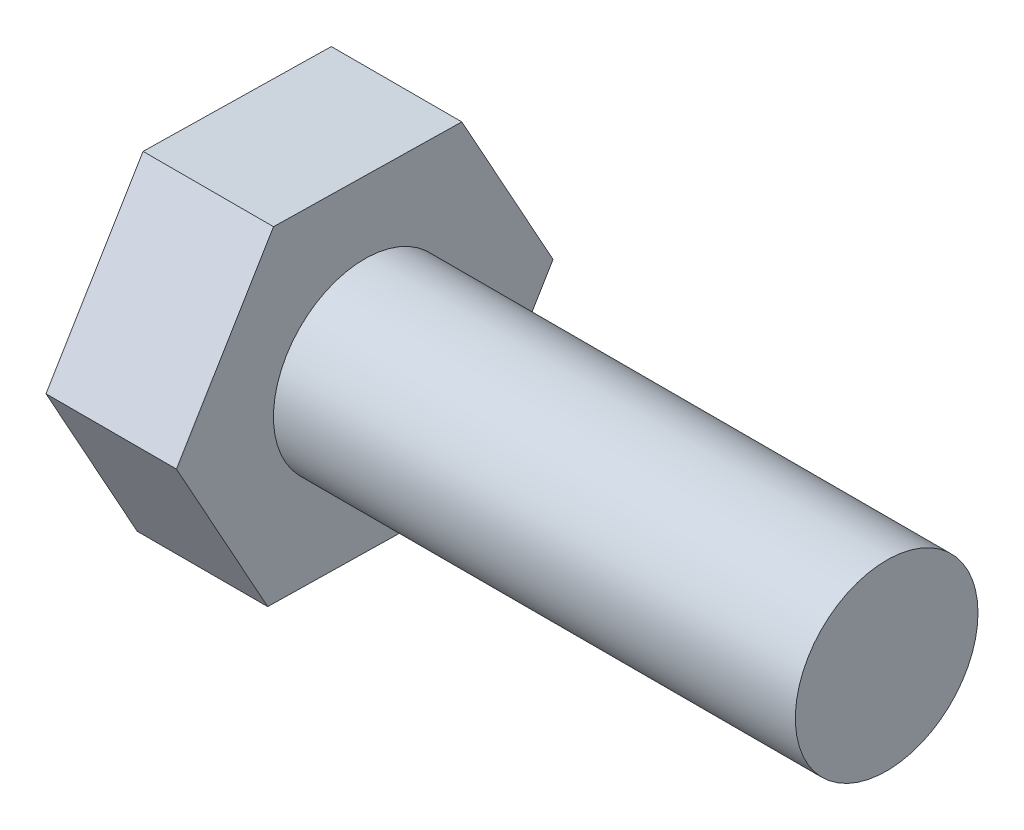
ISO-10303-21;
HEADER;
FILE_DESCRIPTION(('STEP AP214'),'2;1');
FILE_NAME('part.step','',(''),(''),'','','');
FILE_SCHEMA(('AUTOMOTIVE_DESIGN { 1 0 10303 214 1 1 1 1 }'));
ENDSEC;
DATA;
#1=APPLICATION_CONTEXT('core data for automotive mechanical design processes');
#2=APPLICATION_PROTOCOL_DEFINITION('international standard','automotive_design',2000,#1);
#3=PRODUCT_CONTEXT('',#1,'mechanical');
#4=PRODUCT('Part','Part','',(#3));
#5=PRODUCT_RELATED_PRODUCT_CATEGORY('part','',(#4));
#6=PRODUCT_DEFINITION_FORMATION('','',#4);
#7=PRODUCT_DEFINITION_CONTEXT('part definition',#1,'design');
#8=PRODUCT_DEFINITION('design','',#6,#7);
#9=PRODUCT_DEFINITION_SHAPE('','',#8);
#10=(LENGTH_UNIT() NAMED_UNIT(*) SI_UNIT(.MILLI.,.METRE.));
#11=(NAMED_UNIT(*) PLANE_ANGLE_UNIT() SI_UNIT($,.RADIAN.));
#12=(NAMED_UNIT(*) SI_UNIT($,.STERADIAN.) SOLID_ANGLE_UNIT());
#13=UNCERTAINTY_MEASURE_WITH_UNIT(LENGTH_MEASURE(1.E-05),#10,'distance_accuracy_value','');
#14=(GEOMETRIC_REPRESENTATION_CONTEXT(3) GLOBAL_UNCERTAINTY_ASSIGNED_CONTEXT((#13)) GLOBAL_UNIT_ASSIGNED_CONTEXT((#10,
#11,#12)) REPRESENTATION_CONTEXT('',''));
#15=CARTESIAN_POINT('',(0.,0.,0.));
#16=DIRECTION('',(0.,0.,1.));
#17=DIRECTION('',(1.,0.,0.));
#18=AXIS2_PLACEMENT_3D('',#15,#16,#17);
#19=CARTESIAN_POINT('',(-10.6,0.256906077015476,14.4314702161951));
#20=DIRECTION('',(0.,-0.515335157468267,-0.856988725408425));
#21=DIRECTION('',(0.,0.856988725408425,-0.515335157468267));
#22=AXIS2_PLACEMENT_3D('',#19,#20,#21);
#23=PLANE('',#22);
#24=DIRECTION('',(0.,0.856988725408425,-0.515335157468267));
#25=VECTOR('',#24,1.);
#26=CARTESIAN_POINT('',(-0.6,0.256906077015476,14.4314702161951));
#27=LINE('',#26,#25);
#28=CARTESIAN_POINT('',(-0.6,0.256906077015476,14.4314702161951));
#29=VERTEX_POINT('',#28);
#30=CARTESIAN_POINT('',(-0.6,12.6264728596912,6.99324791901554));
#31=VERTEX_POINT('',#30);
#32=EDGE_CURVE('E126',#29,#31,#27,.T.);
#33=ORIENTED_EDGE('',*,*,#32,.T.);
#34=DIRECTION('',(1.,0.,0.));
#35=VECTOR('',#34,1.);
#36=CARTESIAN_POINT('',(-10.6,12.6264728596912,6.99324791901554));
#37=LINE('',#36,#35);
#38=CARTESIAN_POINT('',(-10.6,12.6264728596912,6.99324791901554));
#39=VERTEX_POINT('',#38);
#40=EDGE_CURVE('E143',#39,#31,#37,.T.);
#41=ORIENTED_EDGE('',*,*,#40,.F.);
#42=DIRECTION('',(0.,0.856988725408425,-0.515335157468267));
#43=VECTOR('',#42,1.);
#44=CARTESIAN_POINT('',(-10.6,0.256906077015476,14.4314702161951));
#45=LINE('',#44,#43);
#46=CARTESIAN_POINT('',(-10.6,0.256906077015476,14.4314702161951));
#47=VERTEX_POINT('',#46);
#48=EDGE_CURVE('E136',#47,#39,#45,.T.);
#49=ORIENTED_EDGE('',*,*,#48,.F.);
#50=DIRECTION('',(1.,0.,0.));
#51=VECTOR('',#50,1.);
#52=CARTESIAN_POINT('',(-10.6,0.256906077015476,14.4314702161951));
#53=LINE('',#52,#51);
#54=EDGE_CURVE('E122',#47,#29,#53,.T.);
#55=ORIENTED_EDGE('',*,*,#54,.T.);
#56=EDGE_LOOP('',(#33,#41,#49,#55));
#57=FACE_BOUND('',#56,.T.);
#58=ADVANCED_FACE('F40',(#57),#23,.F.);
#59=CARTESIAN_POINT('',(-10.6,12.6264728596912,6.99324791901554));
#60=DIRECTION('',(0.,-0.999841585694676,0.01779897512656));
#61=DIRECTION('',(0.,-0.01779897512656,-0.999841585694676));
#62=AXIS2_PLACEMENT_3D('',#59,#60,#61);
#63=PLANE('',#62);
#64=DIRECTION('',(0.,-0.01779897512656,-0.999841585694676));
#65=VECTOR('',#64,1.);
#66=CARTESIAN_POINT('',(-0.6,12.6264728596912,6.99324791901554));
#67=LINE('',#66,#65);
#68=CARTESIAN_POINT('',(-0.6,12.3695667826757,-7.43822229717955));
#69=VERTEX_POINT('',#68);
#70=EDGE_CURVE('E129',#31,#69,#67,.T.);
#71=ORIENTED_EDGE('',*,*,#70,.T.);
#72=DIRECTION('',(1.,0.,0.));
#73=VECTOR('',#72,1.);
#74=CARTESIAN_POINT('',(-10.6,12.3695667826757,-7.43822229717955));
#75=LINE('',#74,#73);
#76=CARTESIAN_POINT('',(-10.6,12.3695667826757,-7.43822229717955));
#77=VERTEX_POINT('',#76);
#78=EDGE_CURVE('E140',#77,#69,#75,.T.);
#79=ORIENTED_EDGE('',*,*,#78,.F.);
#80=DIRECTION('',(0.,-0.01779897512656,-0.999841585694676));
#81=VECTOR('',#80,1.);
#82=CARTESIAN_POINT('',(-10.6,12.6264728596912,6.99324791901554));
#83=LINE('',#82,#81);
#84=EDGE_CURVE('E95',#39,#77,#83,.T.);
#85=ORIENTED_EDGE('',*,*,#84,.F.);
#86=ORIENTED_EDGE('',*,*,#40,.T.);
#87=EDGE_LOOP('',(#71,#79,#85,#86));
#88=FACE_BOUND('',#87,.T.);
#89=ADVANCED_FACE('F167',(#88),#63,.F.);
#90=CARTESIAN_POINT('',(-10.6,12.3695667826757,-7.43822229717955));
#91=DIRECTION('',(0.,-0.484506428226409,0.874787700534986));
#92=DIRECTION('',(0.,-0.874787700534986,-0.484506428226409));
#93=AXIS2_PLACEMENT_3D('',#90,#91,#92);
#94=PLANE('',#93);
#95=DIRECTION('',(0.,-0.874787700534985,-0.484506428226409));
#96=VECTOR('',#95,1.);
#97=CARTESIAN_POINT('',(-0.6,12.3695667826757,-7.43822229717955));
#98=LINE('',#97,#96);
#99=CARTESIAN_POINT('',(-0.6,-0.256906077015476,-14.4314702161951));
#100=VERTEX_POINT('',#99);
#101=EDGE_CURVE('E131',#69,#100,#98,.T.);
#102=ORIENTED_EDGE('',*,*,#101,.T.);
#103=DIRECTION('',(1.,0.,0.));
#104=VECTOR('',#103,1.);
#105=CARTESIAN_POINT('',(-10.6,-0.256906077015476,-14.4314702161951));
#106=LINE('',#105,#104);
#107=CARTESIAN_POINT('',(-10.6,-0.256906077015476,-14.4314702161951));
#108=VERTEX_POINT('',#107);
#109=EDGE_CURVE('E117',#108,#100,#106,.T.);
#110=ORIENTED_EDGE('',*,*,#109,.F.);
#111=DIRECTION('',(0.,-0.874787700534985,-0.484506428226409));
#112=VECTOR('',#111,1.);
#113=CARTESIAN_POINT('',(-10.6,12.3695667826757,-7.43822229717955));
#114=LINE('',#113,#112);
#115=EDGE_CURVE('E108',#77,#108,#114,.T.);
#116=ORIENTED_EDGE('',*,*,#115,.F.);
#117=ORIENTED_EDGE('',*,*,#78,.T.);
#118=EDGE_LOOP('',(#102,#110,#116,#117));
#119=FACE_BOUND('',#118,.T.);
#120=ADVANCED_FACE('F172',(#119),#94,.F.);
#121=CARTESIAN_POINT('',(-10.6,-0.256906077015476,-14.4314702161951));
#122=DIRECTION('',(0.,0.515335157468266,0.856988725408425));
#123=DIRECTION('',(0.,-0.856988725408425,0.515335157468266));
#124=AXIS2_PLACEMENT_3D('',#121,#122,#123);
#125=PLANE('',#124);
#126=DIRECTION('',(0.,-0.856988725408425,0.515335157468266));
#127=VECTOR('',#126,1.);
#128=CARTESIAN_POINT('',(-0.6,-0.256906077015476,-14.4314702161951));
#129=LINE('',#128,#127);
#130=CARTESIAN_POINT('',(-0.6,-12.6264728596912,-6.99324791901554));
#131=VERTEX_POINT('',#130);
#132=EDGE_CURVE('E116',#100,#131,#129,.T.);
#133=ORIENTED_EDGE('',*,*,#132,.T.);
#134=DIRECTION('',(1.,0.,0.));
#135=VECTOR('',#134,1.);
#136=CARTESIAN_POINT('',(-10.6,-12.6264728596912,-6.99324791901554));
#137=LINE('',#136,#135);
#138=CARTESIAN_POINT('',(-10.6,-12.6264728596912,-6.99324791901554));
#139=VERTEX_POINT('',#138);
#140=EDGE_CURVE('E113',#139,#131,#137,.T.);
#141=ORIENTED_EDGE('',*,*,#140,.F.);
#142=DIRECTION('',(0.,-0.856988725408425,0.515335157468266));
#143=VECTOR('',#142,1.);
#144=CARTESIAN_POINT('',(-10.6,-0.256906077015476,-14.4314702161951));
#145=LINE('',#144,#143);
#146=EDGE_CURVE('E102',#108,#139,#145,.T.);
#147=ORIENTED_EDGE('',*,*,#146,.F.);
#148=ORIENTED_EDGE('',*,*,#109,.T.);
#149=EDGE_LOOP('',(#133,#141,#147,#148));
#150=FACE_BOUND('',#149,.T.);
#151=ADVANCED_FACE('F114',(#150),#125,.F.);
#152=CARTESIAN_POINT('',(-10.6,-12.6264728596912,-6.99324791901554));
#153=DIRECTION('',(0.,0.999841585694676,-0.0177989751265602));
#154=DIRECTION('',(0.,0.0177989751265602,0.999841585694676));
#155=AXIS2_PLACEMENT_3D('',#152,#153,#154);
#156=PLANE('',#155);
#157=DIRECTION('',(0.,0.0177989751265602,0.999841585694676));
#158=VECTOR('',#157,1.);
#159=CARTESIAN_POINT('',(-0.6,-12.6264728596912,-6.99324791901554));
#160=LINE('',#159,#158);
#161=CARTESIAN_POINT('',(-0.6,-12.3695667826757,7.43822229717955));
#162=VERTEX_POINT('',#161);
#163=EDGE_CURVE('E80',#131,#162,#160,.T.);
#164=ORIENTED_EDGE('',*,*,#163,.T.);
#165=DIRECTION('',(1.,0.,0.));
#166=VECTOR('',#165,1.);
#167=CARTESIAN_POINT('',(-10.6,-12.3695667826757,7.43822229717955));
#168=LINE('',#167,#166);
#169=CARTESIAN_POINT('',(-10.6,-12.3695667826757,7.43822229717955));
#170=VERTEX_POINT('',#169);
#171=EDGE_CURVE('E118',#170,#162,#168,.T.);
#172=ORIENTED_EDGE('',*,*,#171,.F.);
#173=DIRECTION('',(0.,0.0177989751265602,0.999841585694676));
#174=VECTOR('',#173,1.);
#175=CARTESIAN_POINT('',(-10.6,-12.6264728596912,-6.99324791901554));
#176=LINE('',#175,#174);
#177=EDGE_CURVE('E106',#139,#170,#176,.T.);
#178=ORIENTED_EDGE('',*,*,#177,.F.);
#179=ORIENTED_EDGE('',*,*,#140,.T.);
#180=EDGE_LOOP('',(#164,#172,#178,#179));
#181=FACE_BOUND('',#180,.T.);
#182=ADVANCED_FACE('F120',(#181),#156,.F.);
#183=CARTESIAN_POINT('',(-10.6,-12.3695667826757,7.43822229717955));
#184=DIRECTION('',(0.,0.48450642822641,-0.874787700534985));
#185=DIRECTION('',(0.,0.874787700534985,0.48450642822641));
#186=AXIS2_PLACEMENT_3D('',#183,#184,#185);
#187=PLANE('',#186);
#188=DIRECTION('',(0.,0.874787700534985,0.484506428226409));
#189=VECTOR('',#188,1.);
#190=CARTESIAN_POINT('',(-0.6,-12.3695667826757,7.43822229717955));
#191=LINE('',#190,#189);
#192=EDGE_CURVE('E86',#162,#29,#191,.T.);
#193=ORIENTED_EDGE('',*,*,#192,.T.);
#194=ORIENTED_EDGE('',*,*,#54,.F.);
#195=DIRECTION('',(0.,0.874787700534985,0.484506428226409));
#196=VECTOR('',#195,1.);
#197=CARTESIAN_POINT('',(-10.6,-12.3695667826757,7.43822229717955));
#198=LINE('',#197,#196);
#199=EDGE_CURVE('E57',#170,#47,#198,.T.);
#200=ORIENTED_EDGE('',*,*,#199,.F.);
#201=ORIENTED_EDGE('',*,*,#171,.T.);
#202=EDGE_LOOP('',(#193,#194,#200,#201));
#203=FACE_BOUND('',#202,.T.);
#204=ADVANCED_FACE('F157',(#203),#187,.F.);
#205=CARTESIAN_POINT('',(-10.6,0.,0.));
#206=DIRECTION('',(-1.,0.,0.));
#207=DIRECTION('',(0.,0.,1.));
#208=AXIS2_PLACEMENT_3D('',#205,#206,#207);
#209=PLANE('',#208);
#210=ORIENTED_EDGE('',*,*,#48,.T.);
#211=ORIENTED_EDGE('',*,*,#84,.T.);
#212=ORIENTED_EDGE('',*,*,#115,.T.);
#213=ORIENTED_EDGE('',*,*,#146,.T.);
#214=ORIENTED_EDGE('',*,*,#177,.T.);
#215=ORIENTED_EDGE('',*,*,#199,.T.);
#216=EDGE_LOOP('',(#210,#211,#212,#213,#214,#215));
#217=FACE_BOUND('',#216,.T.);
#218=ADVANCED_FACE('F104',(#217),#209,.T.);
#219=CARTESIAN_POINT('',(39.4,0.,0.));
#220=DIRECTION('',(-1.,0.,0.));
#221=DIRECTION('',(0.,0.,1.));
#222=AXIS2_PLACEMENT_3D('',#219,#220,#221);
#223=CYLINDRICAL_SURFACE('',#222,7.);
#224=CARTESIAN_POINT('',(39.4,0.,0.));
#225=DIRECTION('',(1.,0.,0.));
#226=DIRECTION('',(0.,0.,-1.));
#227=AXIS2_PLACEMENT_3D('',#224,#225,#226);
#228=CIRCLE('',#227,7.);
#229=CARTESIAN_POINT('',(39.4,0.,-7.));
#230=VERTEX_POINT('',#229);
#231=EDGE_CURVE('E11',#230,#230,#228,.T.);
#232=ORIENTED_EDGE('',*,*,#231,.F.);
#233=EDGE_LOOP('',(#232));
#234=FACE_BOUND('',#233,.T.);
#235=CARTESIAN_POINT('',(-0.6,0.,0.));
#236=DIRECTION('',(1.,0.,0.));
#237=DIRECTION('',(0.,0.,-1.));
#238=AXIS2_PLACEMENT_3D('',#235,#236,#237);
#239=CIRCLE('',#238,7.);
#240=CARTESIAN_POINT('',(-0.6,0.,-7.));
#241=VERTEX_POINT('',#240);
#242=EDGE_CURVE('E44',#241,#241,#239,.T.);
#243=ORIENTED_EDGE('',*,*,#242,.T.);
#244=EDGE_LOOP('',(#243));
#245=FACE_BOUND('',#244,.T.);
#246=ADVANCED_FACE('F148',(#234,#245),#223,.T.);
#247=CARTESIAN_POINT('',(39.4,0.,0.));
#248=DIRECTION('',(1.,0.,0.));
#249=DIRECTION('',(0.,0.,-1.));
#250=AXIS2_PLACEMENT_3D('',#247,#248,#249);
#251=PLANE('',#250);
#252=ORIENTED_EDGE('',*,*,#231,.T.);
#253=EDGE_LOOP('',(#252));
#254=FACE_BOUND('',#253,.T.);
#255=ADVANCED_FACE('F152',(#254),#251,.T.);
#256=CARTESIAN_POINT('',(-0.6,7.50555349946513,0.));
#257=DIRECTION('',(-1.,0.,0.));
#258=DIRECTION('',(0.,0.,1.));
#259=AXIS2_PLACEMENT_3D('',#256,#257,#258);
#260=PLANE('',#259);
#261=ORIENTED_EDGE('',*,*,#242,.F.);
#262=EDGE_LOOP('',(#261));
#263=FACE_BOUND('',#262,.T.);
#264=ORIENTED_EDGE('',*,*,#32,.F.);
#265=ORIENTED_EDGE('',*,*,#192,.F.);
#266=ORIENTED_EDGE('',*,*,#163,.F.);
#267=ORIENTED_EDGE('',*,*,#132,.F.);
#268=ORIENTED_EDGE('',*,*,#101,.F.);
#269=ORIENTED_EDGE('',*,*,#70,.F.);
#270=EDGE_LOOP('',(#264,#265,#266,#267,#268,#269));
#271=FACE_BOUND('',#270,.T.);
#272=ADVANCED_FACE('F42',(#263,#271),#260,.F.);
#273=CLOSED_SHELL('',(#58,#89,#120,#151,#182,#204,#218,#246,#255,#272));
#274=MANIFOLD_SOLID_BREP('B2',#273);
#275=ADVANCED_BREP_SHAPE_REPRESENTATION('',(#18,#274),#14);
#276=SHAPE_DEFINITION_REPRESENTATION(#9,#275);
ENDSEC;
END-ISO-10303-21;
